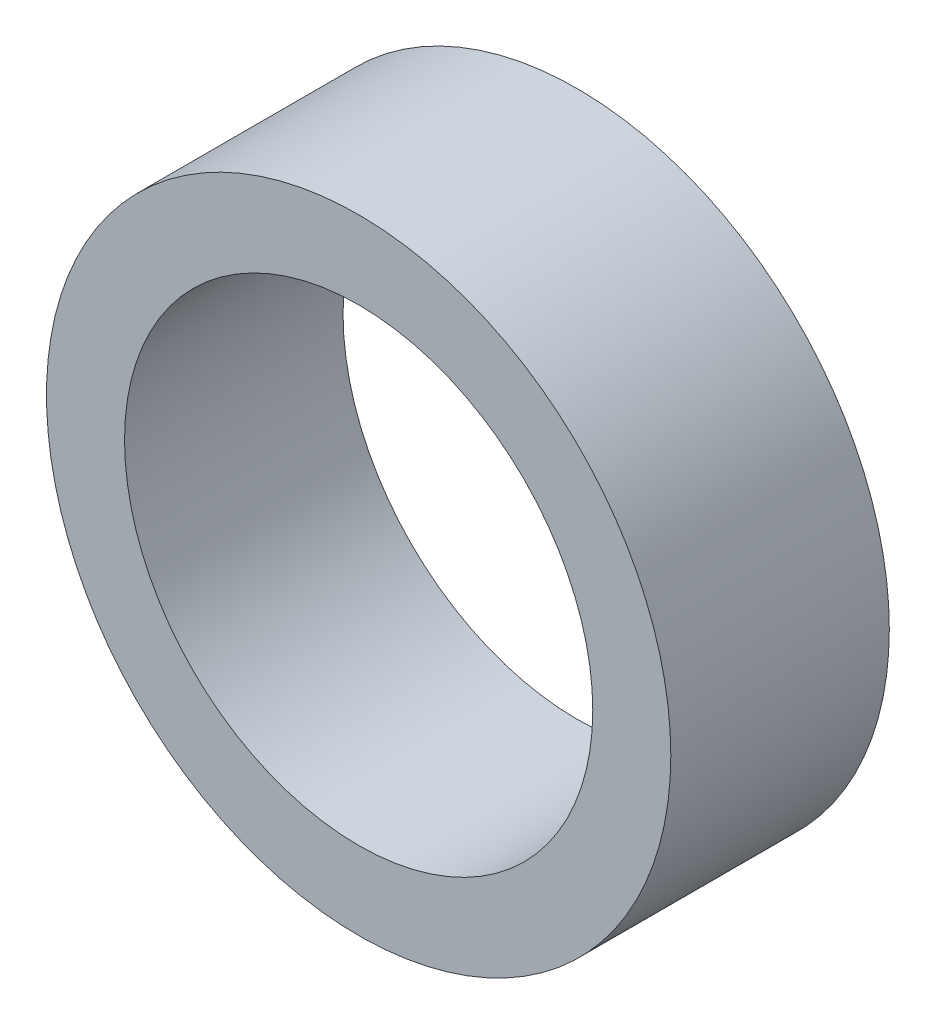
ISO-10303-21;
HEADER;
FILE_DESCRIPTION(('STEP AP214'),'2;1');
FILE_NAME('part.step','',(''),(''),'','','');
FILE_SCHEMA(('AUTOMOTIVE_DESIGN { 1 0 10303 214 1 1 1 1 }'));
ENDSEC;
DATA;
#1=APPLICATION_CONTEXT('core data for automotive mechanical design processes');
#2=APPLICATION_PROTOCOL_DEFINITION('international standard','automotive_design',2000,#1);
#3=PRODUCT_CONTEXT('',#1,'mechanical');
#4=PRODUCT('Part','Part','',(#3));
#5=PRODUCT_RELATED_PRODUCT_CATEGORY('part','',(#4));
#6=PRODUCT_DEFINITION_FORMATION('','',#4);
#7=PRODUCT_DEFINITION_CONTEXT('part definition',#1,'design');
#8=PRODUCT_DEFINITION('design','',#6,#7);
#9=PRODUCT_DEFINITION_SHAPE('','',#8);
#10=(LENGTH_UNIT() NAMED_UNIT(*) SI_UNIT(.MILLI.,.METRE.));
#11=(NAMED_UNIT(*) PLANE_ANGLE_UNIT() SI_UNIT($,.RADIAN.));
#12=(NAMED_UNIT(*) SI_UNIT($,.STERADIAN.) SOLID_ANGLE_UNIT());
#13=UNCERTAINTY_MEASURE_WITH_UNIT(LENGTH_MEASURE(1.E-05),#10,'distance_accuracy_value','');
#14=(GEOMETRIC_REPRESENTATION_CONTEXT(3) GLOBAL_UNCERTAINTY_ASSIGNED_CONTEXT((#13)) GLOBAL_UNIT_ASSIGNED_CONTEXT((#10,
#11,#12)) REPRESENTATION_CONTEXT('',''));
#15=CARTESIAN_POINT('',(0.,0.,0.));
#16=DIRECTION('',(0.,0.,1.));
#17=DIRECTION('',(1.,0.,0.));
#18=AXIS2_PLACEMENT_3D('',#15,#16,#17);
#19=CARTESIAN_POINT('',(-20.,-9.99999017609959,2.8));
#20=DIRECTION('',(0.,0.,1.));
#21=DIRECTION('',(1.,0.,0.));
#22=AXIS2_PLACEMENT_3D('',#19,#20,#21);
#23=PLANE('',#22);
#24=CARTESIAN_POINT('',(-20.,-9.99999017609959,2.8));
#25=DIRECTION('',(0.,0.,1.));
#26=DIRECTION('',(1.,0.,0.));
#27=AXIS2_PLACEMENT_3D('',#24,#25,#26);
#28=CIRCLE('',#27,4.);
#29=CARTESIAN_POINT('',(-16.,-9.99999017609959,2.8));
#30=VERTEX_POINT('',#29);
#31=EDGE_CURVE('E10',#30,#30,#28,.T.);
#32=ORIENTED_EDGE('',*,*,#31,.T.);
#33=EDGE_LOOP('',(#32));
#34=FACE_BOUND('',#33,.T.);
#35=CARTESIAN_POINT('',(-20.,-9.99999017609959,2.8));
#36=DIRECTION('',(0.,0.,1.));
#37=DIRECTION('',(1.,0.,0.));
#38=AXIS2_PLACEMENT_3D('',#35,#36,#37);
#39=CIRCLE('',#38,3.);
#40=CARTESIAN_POINT('',(-17.,-9.99999017609959,2.8));
#41=VERTEX_POINT('',#40);
#42=EDGE_CURVE('E42',#41,#41,#39,.T.);
#43=ORIENTED_EDGE('',*,*,#42,.F.);
#44=EDGE_LOOP('',(#43));
#45=FACE_BOUND('',#44,.T.);
#46=ADVANCED_FACE('F31',(#34,#45),#23,.T.);
#47=CARTESIAN_POINT('',(-20.,-9.99999017609959,0.));
#48=DIRECTION('',(0.,0.,1.));
#49=DIRECTION('',(1.,0.,0.));
#50=AXIS2_PLACEMENT_3D('',#47,#48,#49);
#51=PLANE('',#50);
#52=CARTESIAN_POINT('',(-20.,-9.99999017609959,0.));
#53=DIRECTION('',(0.,0.,1.));
#54=DIRECTION('',(1.,0.,0.));
#55=AXIS2_PLACEMENT_3D('',#52,#53,#54);
#56=CIRCLE('',#55,4.);
#57=CARTESIAN_POINT('',(-16.,-9.99999017609959,0.));
#58=VERTEX_POINT('',#57);
#59=EDGE_CURVE('E35',#58,#58,#56,.T.);
#60=ORIENTED_EDGE('',*,*,#59,.F.);
#61=EDGE_LOOP('',(#60));
#62=FACE_BOUND('',#61,.T.);
#63=CARTESIAN_POINT('',(-20.,-9.99999017609959,0.));
#64=DIRECTION('',(0.,0.,1.));
#65=DIRECTION('',(1.,0.,0.));
#66=AXIS2_PLACEMENT_3D('',#63,#64,#65);
#67=CIRCLE('',#66,3.);
#68=CARTESIAN_POINT('',(-17.,-9.99999017609959,0.));
#69=VERTEX_POINT('',#68);
#70=EDGE_CURVE('E44',#69,#69,#67,.T.);
#71=ORIENTED_EDGE('',*,*,#70,.T.);
#72=EDGE_LOOP('',(#71));
#73=FACE_BOUND('',#72,.T.);
#74=ADVANCED_FACE('F54',(#62,#73),#51,.F.);
#75=CARTESIAN_POINT('',(-20.,-9.99999017609959,2.8));
#76=DIRECTION('',(0.,0.,-1.));
#77=DIRECTION('',(-1.,0.,0.));
#78=AXIS2_PLACEMENT_3D('',#75,#76,#77);
#79=CYLINDRICAL_SURFACE('',#78,4.);
#80=ORIENTED_EDGE('',*,*,#31,.F.);
#81=EDGE_LOOP('',(#80));
#82=FACE_BOUND('',#81,.T.);
#83=ORIENTED_EDGE('',*,*,#59,.T.);
#84=EDGE_LOOP('',(#83));
#85=FACE_BOUND('',#84,.T.);
#86=ADVANCED_FACE('F33',(#82,#85),#79,.T.);
#87=CARTESIAN_POINT('',(-20.,-9.99999017609959,2.8));
#88=DIRECTION('',(0.,0.,-1.));
#89=DIRECTION('',(-1.,0.,0.));
#90=AXIS2_PLACEMENT_3D('',#87,#88,#89);
#91=CYLINDRICAL_SURFACE('',#90,3.);
#92=ORIENTED_EDGE('',*,*,#42,.T.);
#93=EDGE_LOOP('',(#92));
#94=FACE_BOUND('',#93,.T.);
#95=ORIENTED_EDGE('',*,*,#70,.F.);
#96=EDGE_LOOP('',(#95));
#97=FACE_BOUND('',#96,.T.);
#98=ADVANCED_FACE('F50',(#94,#97),#91,.F.);
#99=CLOSED_SHELL('',(#46,#74,#86,#98));
#100=MANIFOLD_SOLID_BREP('B2',#99);
#101=ADVANCED_BREP_SHAPE_REPRESENTATION('',(#18,#100),#14);
#102=SHAPE_DEFINITION_REPRESENTATION(#9,#101);
ENDSEC;
END-ISO-10303-21;
